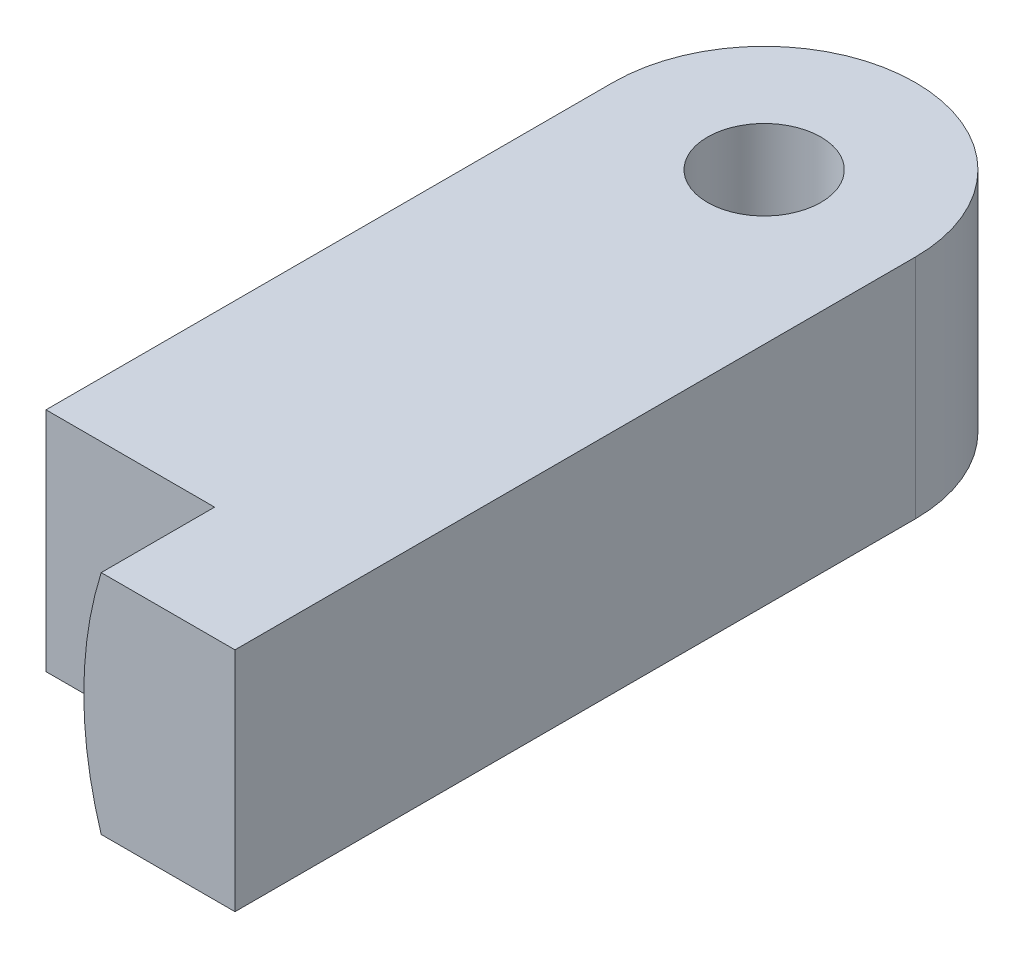
ISO-10303-21;
HEADER;
FILE_DESCRIPTION(('STEP AP214'),'2;1');
FILE_NAME('part.step','',(''),(''),'','','');
FILE_SCHEMA(('AUTOMOTIVE_DESIGN { 1 0 10303 214 1 1 1 1 }'));
ENDSEC;
DATA;
#1=APPLICATION_CONTEXT('core data for automotive mechanical design processes');
#2=APPLICATION_PROTOCOL_DEFINITION('international standard','automotive_design',2000,#1);
#3=PRODUCT_CONTEXT('',#1,'mechanical');
#4=PRODUCT('Part','Part','',(#3));
#5=PRODUCT_RELATED_PRODUCT_CATEGORY('part','',(#4));
#6=PRODUCT_DEFINITION_FORMATION('','',#4);
#7=PRODUCT_DEFINITION_CONTEXT('part definition',#1,'design');
#8=PRODUCT_DEFINITION('design','',#6,#7);
#9=PRODUCT_DEFINITION_SHAPE('','',#8);
#10=(LENGTH_UNIT() NAMED_UNIT(*) SI_UNIT(.MILLI.,.METRE.));
#11=(NAMED_UNIT(*) PLANE_ANGLE_UNIT() SI_UNIT($,.RADIAN.));
#12=(NAMED_UNIT(*) SI_UNIT($,.STERADIAN.) SOLID_ANGLE_UNIT());
#13=UNCERTAINTY_MEASURE_WITH_UNIT(LENGTH_MEASURE(1.E-05),#10,'distance_accuracy_value','');
#14=(GEOMETRIC_REPRESENTATION_CONTEXT(3) GLOBAL_UNCERTAINTY_ASSIGNED_CONTEXT((#13)) GLOBAL_UNIT_ASSIGNED_CONTEXT((#10,
#11,#12)) REPRESENTATION_CONTEXT('',''));
#15=CARTESIAN_POINT('',(0.,0.,0.));
#16=DIRECTION('',(0.,0.,1.));
#17=DIRECTION('',(1.,0.,0.));
#18=AXIS2_PLACEMENT_3D('',#15,#16,#17);
#19=CARTESIAN_POINT('',(0.,0.,25.));
#20=DIRECTION('',(0.,0.,1.));
#21=DIRECTION('',(1.,0.,0.));
#22=AXIS2_PLACEMENT_3D('',#19,#20,#21);
#23=PLANE('',#22);
#24=CARTESIAN_POINT('',(10.,0.,25.));
#25=DIRECTION('',(0.,0.,1.));
#26=DIRECTION('',(1.,0.,0.));
#27=AXIS2_PLACEMENT_3D('',#24,#25,#26);
#28=CIRCLE('',#27,10.);
#29=CARTESIAN_POINT('',(0.460607985830542,3.,25.));
#30=VERTEX_POINT('',#29);
#31=CARTESIAN_POINT('',(0.460607985830542,-3.,25.));
#32=VERTEX_POINT('',#31);
#33=EDGE_CURVE('E121',#30,#32,#28,.T.);
#34=ORIENTED_EDGE('',*,*,#33,.T.);
#35=DIRECTION('',(1.,0.,0.));
#36=VECTOR('',#35,1.);
#37=CARTESIAN_POINT('',(-4.,-3.,25.));
#38=LINE('',#37,#36);
#39=CARTESIAN_POINT('',(4.,-3.,25.));
#40=VERTEX_POINT('',#39);
#41=EDGE_CURVE('E71',#32,#40,#38,.T.);
#42=ORIENTED_EDGE('',*,*,#41,.T.);
#43=DIRECTION('',(0.,1.,0.));
#44=VECTOR('',#43,1.);
#45=CARTESIAN_POINT('',(4.,3.,25.));
#46=LINE('',#45,#44);
#47=CARTESIAN_POINT('',(4.,3.,25.));
#48=VERTEX_POINT('',#47);
#49=EDGE_CURVE('E143',#40,#48,#46,.T.);
#50=ORIENTED_EDGE('',*,*,#49,.T.);
#51=DIRECTION('',(-1.,0.,0.));
#52=VECTOR('',#51,1.);
#53=CARTESIAN_POINT('',(-4.,3.,25.));
#54=LINE('',#53,#52);
#55=EDGE_CURVE('E145',#48,#30,#54,.T.);
#56=ORIENTED_EDGE('',*,*,#55,.T.);
#57=EDGE_LOOP('',(#34,#42,#50,#56));
#58=FACE_BOUND('',#57,.T.);
#59=ADVANCED_FACE('F48',(#58),#23,.T.);
#60=CARTESIAN_POINT('',(-4.,-3.,25.));
#61=DIRECTION('',(0.,1.,0.));
#62=DIRECTION('',(0.,0.,1.));
#63=AXIS2_PLACEMENT_3D('',#60,#61,#62);
#64=PLANE('',#63);
#65=CARTESIAN_POINT('',(0.,-3.,7.));
#66=DIRECTION('',(0.,-1.,0.));
#67=DIRECTION('',(0.,0.,-1.));
#68=AXIS2_PLACEMENT_3D('',#65,#66,#67);
#69=CIRCLE('',#68,1.5);
#70=CARTESIAN_POINT('',(0.,-3.,5.5));
#71=VERTEX_POINT('',#70);
#72=EDGE_CURVE('E137',#71,#71,#69,.T.);
#73=ORIENTED_EDGE('',*,*,#72,.F.);
#74=EDGE_LOOP('',(#73));
#75=FACE_BOUND('',#74,.T.);
#76=DIRECTION('',(0.,0.,1.));
#77=VECTOR('',#76,1.);
#78=CARTESIAN_POINT('',(0.460607985830542,-3.,22.));
#79=LINE('',#78,#77);
#80=CARTESIAN_POINT('',(0.460607985830542,-3.,22.));
#81=VERTEX_POINT('',#80);
#82=EDGE_CURVE('E118',#81,#32,#79,.T.);
#83=ORIENTED_EDGE('',*,*,#82,.F.);
#84=DIRECTION('',(1.,0.,0.));
#85=VECTOR('',#84,1.);
#86=CARTESIAN_POINT('',(-4.,-3.,22.));
#87=LINE('',#86,#85);
#88=CARTESIAN_POINT('',(-4.,-3.,22.));
#89=VERTEX_POINT('',#88);
#90=EDGE_CURVE('E102',#89,#81,#87,.T.);
#91=ORIENTED_EDGE('',*,*,#90,.F.);
#92=DIRECTION('',(0.,0.,-1.));
#93=VECTOR('',#92,1.);
#94=CARTESIAN_POINT('',(-4.,-3.,25.));
#95=LINE('',#94,#93);
#96=CARTESIAN_POINT('',(-4.,-3.,7.));
#97=VERTEX_POINT('',#96);
#98=EDGE_CURVE('E152',#89,#97,#95,.T.);
#99=ORIENTED_EDGE('',*,*,#98,.T.);
#100=CARTESIAN_POINT('',(0.,-3.,7.));
#101=DIRECTION('',(0.,1.,0.));
#102=DIRECTION('',(0.,0.,1.));
#103=AXIS2_PLACEMENT_3D('',#100,#101,#102);
#104=CIRCLE('',#103,4.);
#105=CARTESIAN_POINT('',(4.,-3.,7.));
#106=VERTEX_POINT('',#105);
#107=EDGE_CURVE('E131',#106,#97,#104,.T.);
#108=ORIENTED_EDGE('',*,*,#107,.F.);
#109=DIRECTION('',(0.,0.,-1.));
#110=VECTOR('',#109,1.);
#111=CARTESIAN_POINT('',(4.,-3.,25.));
#112=LINE('',#111,#110);
#113=EDGE_CURVE('E149',#40,#106,#112,.T.);
#114=ORIENTED_EDGE('',*,*,#113,.F.);
#115=ORIENTED_EDGE('',*,*,#41,.F.);
#116=EDGE_LOOP('',(#83,#91,#99,#108,#114,#115));
#117=FACE_BOUND('',#116,.T.);
#118=ADVANCED_FACE('F123',(#75,#117),#64,.F.);
#119=CARTESIAN_POINT('',(-4.,3.,25.));
#120=DIRECTION('',(0.,-1.,0.));
#121=DIRECTION('',(0.,0.,-1.));
#122=AXIS2_PLACEMENT_3D('',#119,#120,#121);
#123=PLANE('',#122);
#124=CARTESIAN_POINT('',(0.,3.,7.));
#125=DIRECTION('',(0.,1.,0.));
#126=DIRECTION('',(0.,0.,1.));
#127=AXIS2_PLACEMENT_3D('',#124,#125,#126);
#128=CIRCLE('',#127,1.5);
#129=CARTESIAN_POINT('',(0.,3.,8.5));
#130=VERTEX_POINT('',#129);
#131=EDGE_CURVE('E128',#130,#130,#128,.T.);
#132=ORIENTED_EDGE('',*,*,#131,.F.);
#133=EDGE_LOOP('',(#132));
#134=FACE_BOUND('',#133,.T.);
#135=DIRECTION('',(0.,0.,1.));
#136=VECTOR('',#135,1.);
#137=CARTESIAN_POINT('',(0.460607985830542,3.,22.));
#138=LINE('',#137,#136);
#139=CARTESIAN_POINT('',(0.460607985830542,3.,22.));
#140=VERTEX_POINT('',#139);
#141=EDGE_CURVE('E120',#140,#30,#138,.T.);
#142=ORIENTED_EDGE('',*,*,#141,.T.);
#143=ORIENTED_EDGE('',*,*,#55,.F.);
#144=DIRECTION('',(0.,0.,-1.));
#145=VECTOR('',#144,1.);
#146=CARTESIAN_POINT('',(4.,3.,25.));
#147=LINE('',#146,#145);
#148=CARTESIAN_POINT('',(4.,3.,7.));
#149=VERTEX_POINT('',#148);
#150=EDGE_CURVE('E12',#48,#149,#147,.T.);
#151=ORIENTED_EDGE('',*,*,#150,.T.);
#152=CARTESIAN_POINT('',(0.,3.,7.));
#153=DIRECTION('',(0.,1.,0.));
#154=DIRECTION('',(0.,0.,1.));
#155=AXIS2_PLACEMENT_3D('',#152,#153,#154);
#156=CIRCLE('',#155,4.);
#157=CARTESIAN_POINT('',(-4.,3.,7.));
#158=VERTEX_POINT('',#157);
#159=EDGE_CURVE('E63',#149,#158,#156,.T.);
#160=ORIENTED_EDGE('',*,*,#159,.T.);
#161=DIRECTION('',(0.,0.,-1.));
#162=VECTOR('',#161,1.);
#163=CARTESIAN_POINT('',(-4.,3.,25.));
#164=LINE('',#163,#162);
#165=CARTESIAN_POINT('',(-4.,3.,22.));
#166=VERTEX_POINT('',#165);
#167=EDGE_CURVE('E56',#166,#158,#164,.T.);
#168=ORIENTED_EDGE('',*,*,#167,.F.);
#169=DIRECTION('',(1.,0.,0.));
#170=VECTOR('',#169,1.);
#171=CARTESIAN_POINT('',(-4.,3.,22.));
#172=LINE('',#171,#170);
#173=EDGE_CURVE('E112',#166,#140,#172,.T.);
#174=ORIENTED_EDGE('',*,*,#173,.T.);
#175=EDGE_LOOP('',(#142,#143,#151,#160,#168,#174));
#176=FACE_BOUND('',#175,.T.);
#177=ADVANCED_FACE('F159',(#134,#176),#123,.F.);
#178=CARTESIAN_POINT('',(-4.,3.,25.));
#179=DIRECTION('',(1.,0.,0.));
#180=DIRECTION('',(0.,1.,0.));
#181=AXIS2_PLACEMENT_3D('',#178,#179,#180);
#182=PLANE('',#181);
#183=DIRECTION('',(0.,1.,0.));
#184=VECTOR('',#183,1.);
#185=CARTESIAN_POINT('',(-4.,-3.,7.));
#186=LINE('',#185,#184);
#187=EDGE_CURVE('E135',#97,#158,#186,.T.);
#188=ORIENTED_EDGE('',*,*,#187,.F.);
#189=ORIENTED_EDGE('',*,*,#98,.F.);
#190=DIRECTION('',(0.,1.,0.));
#191=VECTOR('',#190,1.);
#192=CARTESIAN_POINT('',(-4.,-3.,22.));
#193=LINE('',#192,#191);
#194=EDGE_CURVE('E107',#89,#166,#193,.T.);
#195=ORIENTED_EDGE('',*,*,#194,.T.);
#196=ORIENTED_EDGE('',*,*,#167,.T.);
#197=EDGE_LOOP('',(#188,#189,#195,#196));
#198=FACE_BOUND('',#197,.T.);
#199=ADVANCED_FACE('F157',(#198),#182,.F.);
#200=CARTESIAN_POINT('',(4.,3.,25.));
#201=DIRECTION('',(-1.,0.,0.));
#202=DIRECTION('',(0.,0.,1.));
#203=AXIS2_PLACEMENT_3D('',#200,#201,#202);
#204=PLANE('',#203);
#205=ORIENTED_EDGE('',*,*,#113,.T.);
#206=DIRECTION('',(0.,1.,0.));
#207=VECTOR('',#206,1.);
#208=CARTESIAN_POINT('',(4.,-3.,7.));
#209=LINE('',#208,#207);
#210=EDGE_CURVE('E133',#106,#149,#209,.T.);
#211=ORIENTED_EDGE('',*,*,#210,.T.);
#212=ORIENTED_EDGE('',*,*,#150,.F.);
#213=ORIENTED_EDGE('',*,*,#49,.F.);
#214=EDGE_LOOP('',(#205,#211,#212,#213));
#215=FACE_BOUND('',#214,.T.);
#216=ADVANCED_FACE('F50',(#215),#204,.F.);
#217=CARTESIAN_POINT('',(-4.,-3.,22.));
#218=DIRECTION('',(0.,0.,1.));
#219=DIRECTION('',(1.,0.,0.));
#220=AXIS2_PLACEMENT_3D('',#217,#218,#219);
#221=PLANE('',#220);
#222=ORIENTED_EDGE('',*,*,#173,.F.);
#223=ORIENTED_EDGE('',*,*,#194,.F.);
#224=ORIENTED_EDGE('',*,*,#90,.T.);
#225=CARTESIAN_POINT('',(10.,0.,22.));
#226=DIRECTION('',(0.,0.,1.));
#227=DIRECTION('',(1.,0.,0.));
#228=AXIS2_PLACEMENT_3D('',#225,#226,#227);
#229=CIRCLE('',#228,10.);
#230=EDGE_CURVE('E105',#140,#81,#229,.T.);
#231=ORIENTED_EDGE('',*,*,#230,.F.);
#232=EDGE_LOOP('',(#222,#223,#224,#231));
#233=FACE_BOUND('',#232,.T.);
#234=ADVANCED_FACE('F104',(#233),#221,.T.);
#235=CARTESIAN_POINT('',(0.,0.,7.));
#236=DIRECTION('',(0.,-1.,0.));
#237=DIRECTION('',(0.,0.,-1.));
#238=AXIS2_PLACEMENT_3D('',#235,#236,#237);
#239=CYLINDRICAL_SURFACE('',#238,1.5);
#240=ORIENTED_EDGE('',*,*,#72,.T.);
#241=EDGE_LOOP('',(#240));
#242=FACE_BOUND('',#241,.T.);
#243=ORIENTED_EDGE('',*,*,#131,.T.);
#244=EDGE_LOOP('',(#243));
#245=FACE_BOUND('',#244,.T.);
#246=ADVANCED_FACE('F166',(#242,#245),#239,.F.);
#247=CARTESIAN_POINT('',(0.,-3.,7.));
#248=DIRECTION('',(0.,1.,0.));
#249=DIRECTION('',(0.,0.,1.));
#250=AXIS2_PLACEMENT_3D('',#247,#248,#249);
#251=CYLINDRICAL_SURFACE('',#250,4.);
#252=ORIENTED_EDGE('',*,*,#159,.F.);
#253=ORIENTED_EDGE('',*,*,#210,.F.);
#254=ORIENTED_EDGE('',*,*,#107,.T.);
#255=ORIENTED_EDGE('',*,*,#187,.T.);
#256=EDGE_LOOP('',(#252,#253,#254,#255));
#257=FACE_BOUND('',#256,.T.);
#258=ADVANCED_FACE('F164',(#257),#251,.T.);
#259=CARTESIAN_POINT('',(10.,0.,22.));
#260=DIRECTION('',(0.,0.,1.));
#261=DIRECTION('',(1.,0.,0.));
#262=AXIS2_PLACEMENT_3D('',#259,#260,#261);
#263=CYLINDRICAL_SURFACE('',#262,10.);
#264=ORIENTED_EDGE('',*,*,#33,.F.);
#265=ORIENTED_EDGE('',*,*,#141,.F.);
#266=ORIENTED_EDGE('',*,*,#230,.T.);
#267=ORIENTED_EDGE('',*,*,#82,.T.);
#268=EDGE_LOOP('',(#264,#265,#266,#267));
#269=FACE_BOUND('',#268,.T.);
#270=ADVANCED_FACE('F117',(#269),#263,.T.);
#271=CLOSED_SHELL('',(#59,#118,#177,#199,#216,#234,#246,#258,#270));
#272=MANIFOLD_SOLID_BREP('B2',#271);
#273=ADVANCED_BREP_SHAPE_REPRESENTATION('',(#18,#272),#14);
#274=SHAPE_DEFINITION_REPRESENTATION(#9,#273);
ENDSEC;
END-ISO-10303-21;
